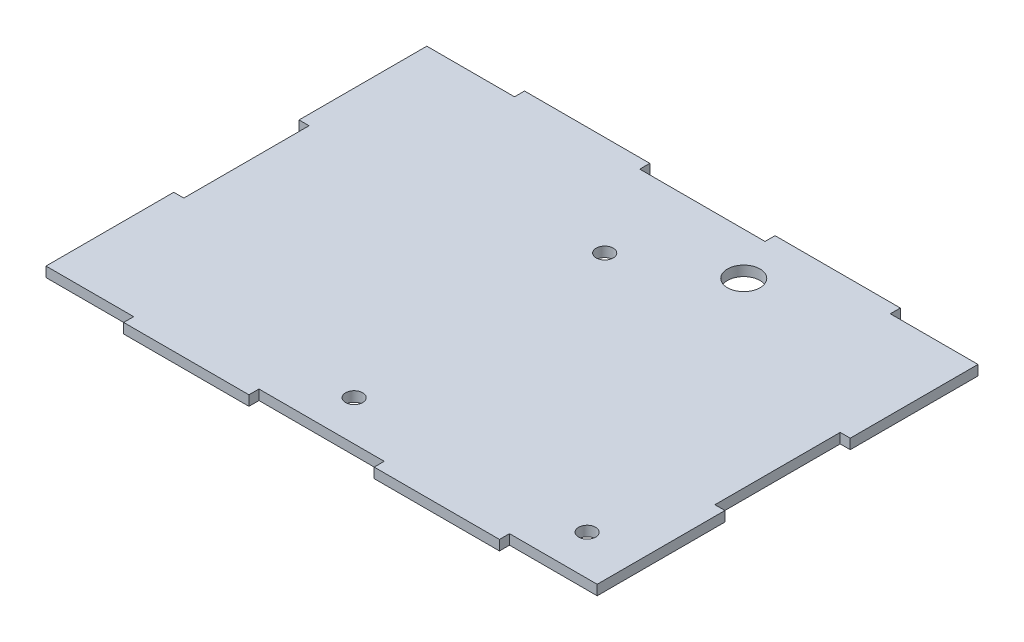
ISO-10303-21;
HEADER;
FILE_DESCRIPTION(('STEP AP214'),'2;1');
FILE_NAME('part.step','',(''),(''),'','','');
FILE_SCHEMA(('AUTOMOTIVE_DESIGN { 1 0 10303 214 1 1 1 1 }'));
ENDSEC;
DATA;
#1=APPLICATION_CONTEXT('core data for automotive mechanical design processes');
#2=APPLICATION_PROTOCOL_DEFINITION('international standard','automotive_design',2000,#1);
#3=PRODUCT_CONTEXT('',#1,'mechanical');
#4=PRODUCT('Part','Part','',(#3));
#5=PRODUCT_RELATED_PRODUCT_CATEGORY('part','',(#4));
#6=PRODUCT_DEFINITION_FORMATION('','',#4);
#7=PRODUCT_DEFINITION_CONTEXT('part definition',#1,'design');
#8=PRODUCT_DEFINITION('design','',#6,#7);
#9=PRODUCT_DEFINITION_SHAPE('','',#8);
#10=(LENGTH_UNIT() NAMED_UNIT(*) SI_UNIT(.MILLI.,.METRE.));
#11=(NAMED_UNIT(*) PLANE_ANGLE_UNIT() SI_UNIT($,.RADIAN.));
#12=(NAMED_UNIT(*) SI_UNIT($,.STERADIAN.) SOLID_ANGLE_UNIT());
#13=UNCERTAINTY_MEASURE_WITH_UNIT(LENGTH_MEASURE(1.E-05),#10,'distance_accuracy_value','');
#14=(GEOMETRIC_REPRESENTATION_CONTEXT(3) GLOBAL_UNCERTAINTY_ASSIGNED_CONTEXT((#13)) GLOBAL_UNIT_ASSIGNED_CONTEXT((#10,
#11,#12)) REPRESENTATION_CONTEXT('',''));
#15=CARTESIAN_POINT('',(0.,0.,0.));
#16=DIRECTION('',(0.,0.,1.));
#17=DIRECTION('',(1.,0.,0.));
#18=AXIS2_PLACEMENT_3D('',#15,#16,#17);
#19=CARTESIAN_POINT('',(-106.,4.,-25.));
#20=DIRECTION('',(0.,0.,-1.));
#21=DIRECTION('',(-1.,0.,0.));
#22=AXIS2_PLACEMENT_3D('',#19,#20,#21);
#23=PLANE('',#22);
#24=DIRECTION('',(1.,0.,0.));
#25=VECTOR('',#24,1.);
#26=CARTESIAN_POINT('',(-106.,0.,-25.));
#27=LINE('',#26,#25);
#28=CARTESIAN_POINT('',(-110.,0.,-25.));
#29=VERTEX_POINT('',#28);
#30=CARTESIAN_POINT('',(-106.,0.,-25.));
#31=VERTEX_POINT('',#30);
#32=EDGE_CURVE('E265',#29,#31,#27,.T.);
#33=ORIENTED_EDGE('',*,*,#32,.T.);
#34=DIRECTION('',(0.,-1.,0.));
#35=VECTOR('',#34,1.);
#36=CARTESIAN_POINT('',(-106.,4.,-25.));
#37=LINE('',#36,#35);
#38=CARTESIAN_POINT('',(-106.,4.,-25.));
#39=VERTEX_POINT('',#38);
#40=EDGE_CURVE('E11',#39,#31,#37,.T.);
#41=ORIENTED_EDGE('',*,*,#40,.F.);
#42=DIRECTION('',(1.,0.,0.));
#43=VECTOR('',#42,1.);
#44=CARTESIAN_POINT('',(-106.,4.,-25.));
#45=LINE('',#44,#43);
#46=CARTESIAN_POINT('',(-110.,4.,-25.));
#47=VERTEX_POINT('',#46);
#48=EDGE_CURVE('E348',#47,#39,#45,.T.);
#49=ORIENTED_EDGE('',*,*,#48,.F.);
#50=DIRECTION('',(0.,-1.,0.));
#51=VECTOR('',#50,1.);
#52=CARTESIAN_POINT('',(-110.,4.,-25.));
#53=LINE('',#52,#51);
#54=EDGE_CURVE('E261',#47,#29,#53,.T.);
#55=ORIENTED_EDGE('',*,*,#54,.T.);
#56=EDGE_LOOP('',(#33,#41,#49,#55));
#57=FACE_BOUND('',#56,.T.);
#58=ADVANCED_FACE('F44',(#57),#23,.F.);
#59=CARTESIAN_POINT('',(-106.,4.,-25.));
#60=DIRECTION('',(1.,0.,0.));
#61=DIRECTION('',(0.,0.,-1.));
#62=AXIS2_PLACEMENT_3D('',#59,#60,#61);
#63=PLANE('',#62);
#64=DIRECTION('',(0.,0.,1.));
#65=VECTOR('',#64,1.);
#66=CARTESIAN_POINT('',(-106.,0.,-25.));
#67=LINE('',#66,#65);
#68=CARTESIAN_POINT('',(-106.,0.,25.));
#69=VERTEX_POINT('',#68);
#70=EDGE_CURVE('E269',#31,#69,#67,.T.);
#71=ORIENTED_EDGE('',*,*,#70,.T.);
#72=DIRECTION('',(0.,-1.,0.));
#73=VECTOR('',#72,1.);
#74=CARTESIAN_POINT('',(-106.,4.,25.));
#75=LINE('',#74,#73);
#76=CARTESIAN_POINT('',(-106.,4.,25.));
#77=VERTEX_POINT('',#76);
#78=EDGE_CURVE('E53',#77,#69,#75,.T.);
#79=ORIENTED_EDGE('',*,*,#78,.F.);
#80=DIRECTION('',(0.,0.,1.));
#81=VECTOR('',#80,1.);
#82=CARTESIAN_POINT('',(-106.,4.,-25.));
#83=LINE('',#82,#81);
#84=EDGE_CURVE('E164',#39,#77,#83,.T.);
#85=ORIENTED_EDGE('',*,*,#84,.F.);
#86=ORIENTED_EDGE('',*,*,#40,.T.);
#87=EDGE_LOOP('',(#71,#79,#85,#86));
#88=FACE_BOUND('',#87,.T.);
#89=ADVANCED_FACE('F556',(#88),#63,.F.);
#90=CARTESIAN_POINT('',(-106.,4.,25.));
#91=DIRECTION('',(0.,0.,1.));
#92=DIRECTION('',(1.,0.,0.));
#93=AXIS2_PLACEMENT_3D('',#90,#91,#92);
#94=PLANE('',#93);
#95=DIRECTION('',(-1.,0.,0.));
#96=VECTOR('',#95,1.);
#97=CARTESIAN_POINT('',(-106.,0.,25.));
#98=LINE('',#97,#96);
#99=CARTESIAN_POINT('',(-110.,0.,25.));
#100=VERTEX_POINT('',#99);
#101=EDGE_CURVE('E273',#69,#100,#98,.T.);
#102=ORIENTED_EDGE('',*,*,#101,.T.);
#103=DIRECTION('',(0.,-1.,0.));
#104=VECTOR('',#103,1.);
#105=CARTESIAN_POINT('',(-110.,4.,25.));
#106=LINE('',#105,#104);
#107=CARTESIAN_POINT('',(-110.,4.,25.));
#108=VERTEX_POINT('',#107);
#109=EDGE_CURVE('E439',#108,#100,#106,.T.);
#110=ORIENTED_EDGE('',*,*,#109,.F.);
#111=DIRECTION('',(-1.,0.,0.));
#112=VECTOR('',#111,1.);
#113=CARTESIAN_POINT('',(-106.,4.,25.));
#114=LINE('',#113,#112);
#115=EDGE_CURVE('E449',#77,#108,#114,.T.);
#116=ORIENTED_EDGE('',*,*,#115,.F.);
#117=ORIENTED_EDGE('',*,*,#78,.T.);
#118=EDGE_LOOP('',(#102,#110,#116,#117));
#119=FACE_BOUND('',#118,.T.);
#120=ADVANCED_FACE('F447',(#119),#94,.F.);
#121=CARTESIAN_POINT('',(-110.,4.,25.));
#122=DIRECTION('',(1.,0.,0.));
#123=DIRECTION('',(0.,0.,-1.));
#124=AXIS2_PLACEMENT_3D('',#121,#122,#123);
#125=PLANE('',#124);
#126=DIRECTION('',(0.,0.,1.));
#127=VECTOR('',#126,1.);
#128=CARTESIAN_POINT('',(-110.,0.,25.));
#129=LINE('',#128,#127);
#130=CARTESIAN_POINT('',(-110.,0.,76.));
#131=VERTEX_POINT('',#130);
#132=EDGE_CURVE('E276',#100,#131,#129,.T.);
#133=ORIENTED_EDGE('',*,*,#132,.T.);
#134=DIRECTION('',(0.,-1.,0.));
#135=VECTOR('',#134,1.);
#136=CARTESIAN_POINT('',(-110.,4.,76.));
#137=LINE('',#136,#135);
#138=CARTESIAN_POINT('',(-110.,4.,76.));
#139=VERTEX_POINT('',#138);
#140=EDGE_CURVE('E435',#139,#131,#137,.T.);
#141=ORIENTED_EDGE('',*,*,#140,.F.);
#142=DIRECTION('',(0.,0.,1.));
#143=VECTOR('',#142,1.);
#144=CARTESIAN_POINT('',(-110.,4.,25.));
#145=LINE('',#144,#143);
#146=EDGE_CURVE('E468',#108,#139,#145,.T.);
#147=ORIENTED_EDGE('',*,*,#146,.F.);
#148=ORIENTED_EDGE('',*,*,#109,.T.);
#149=EDGE_LOOP('',(#133,#141,#147,#148));
#150=FACE_BOUND('',#149,.T.);
#151=ADVANCED_FACE('F458',(#150),#125,.F.);
#152=CARTESIAN_POINT('',(-110.,4.,76.));
#153=DIRECTION('',(0.,0.,-1.));
#154=DIRECTION('',(-1.,0.,0.));
#155=AXIS2_PLACEMENT_3D('',#152,#153,#154);
#156=PLANE('',#155);
#157=DIRECTION('',(1.,0.,0.));
#158=VECTOR('',#157,1.);
#159=CARTESIAN_POINT('',(-110.,0.,76.));
#160=LINE('',#159,#158);
#161=CARTESIAN_POINT('',(-75.,0.,76.));
#162=VERTEX_POINT('',#161);
#163=EDGE_CURVE('E279',#131,#162,#160,.T.);
#164=ORIENTED_EDGE('',*,*,#163,.T.);
#165=DIRECTION('',(0.,-1.,0.));
#166=VECTOR('',#165,1.);
#167=CARTESIAN_POINT('',(-75.,4.,76.));
#168=LINE('',#167,#166);
#169=CARTESIAN_POINT('',(-75.,4.,76.));
#170=VERTEX_POINT('',#169);
#171=EDGE_CURVE('E431',#170,#162,#168,.T.);
#172=ORIENTED_EDGE('',*,*,#171,.F.);
#173=DIRECTION('',(1.,0.,0.));
#174=VECTOR('',#173,1.);
#175=CARTESIAN_POINT('',(-110.,4.,76.));
#176=LINE('',#175,#174);
#177=EDGE_CURVE('E464',#139,#170,#176,.T.);
#178=ORIENTED_EDGE('',*,*,#177,.F.);
#179=ORIENTED_EDGE('',*,*,#140,.T.);
#180=EDGE_LOOP('',(#164,#172,#178,#179));
#181=FACE_BOUND('',#180,.T.);
#182=ADVANCED_FACE('F462',(#181),#156,.F.);
#183=CARTESIAN_POINT('',(-75.,4.,80.));
#184=DIRECTION('',(1.,0.,0.));
#185=DIRECTION('',(0.,0.,-1.));
#186=AXIS2_PLACEMENT_3D('',#183,#184,#185);
#187=PLANE('',#186);
#188=DIRECTION('',(0.,0.,1.));
#189=VECTOR('',#188,1.);
#190=CARTESIAN_POINT('',(-75.,0.,80.));
#191=LINE('',#190,#189);
#192=CARTESIAN_POINT('',(-75.,0.,80.));
#193=VERTEX_POINT('',#192);
#194=EDGE_CURVE('E282',#162,#193,#191,.T.);
#195=ORIENTED_EDGE('',*,*,#194,.T.);
#196=DIRECTION('',(0.,-1.,0.));
#197=VECTOR('',#196,1.);
#198=CARTESIAN_POINT('',(-75.,4.,80.));
#199=LINE('',#198,#197);
#200=CARTESIAN_POINT('',(-75.,4.,80.));
#201=VERTEX_POINT('',#200);
#202=EDGE_CURVE('E427',#201,#193,#199,.T.);
#203=ORIENTED_EDGE('',*,*,#202,.F.);
#204=DIRECTION('',(0.,0.,1.));
#205=VECTOR('',#204,1.);
#206=CARTESIAN_POINT('',(-75.,4.,80.));
#207=LINE('',#206,#205);
#208=EDGE_CURVE('E467',#170,#201,#207,.T.);
#209=ORIENTED_EDGE('',*,*,#208,.F.);
#210=ORIENTED_EDGE('',*,*,#171,.T.);
#211=EDGE_LOOP('',(#195,#203,#209,#210));
#212=FACE_BOUND('',#211,.T.);
#213=ADVANCED_FACE('F569',(#212),#187,.F.);
#214=CARTESIAN_POINT('',(-75.,4.,80.));
#215=DIRECTION('',(0.,0.,-1.));
#216=DIRECTION('',(-1.,0.,0.));
#217=AXIS2_PLACEMENT_3D('',#214,#215,#216);
#218=PLANE('',#217);
#219=DIRECTION('',(1.,0.,0.));
#220=VECTOR('',#219,1.);
#221=CARTESIAN_POINT('',(-75.,0.,80.));
#222=LINE('',#221,#220);
#223=CARTESIAN_POINT('',(-25.,0.,80.));
#224=VERTEX_POINT('',#223);
#225=EDGE_CURVE('E285',#193,#224,#222,.T.);
#226=ORIENTED_EDGE('',*,*,#225,.T.);
#227=DIRECTION('',(0.,-1.,0.));
#228=VECTOR('',#227,1.);
#229=CARTESIAN_POINT('',(-25.,4.,80.));
#230=LINE('',#229,#228);
#231=CARTESIAN_POINT('',(-25.,4.,80.));
#232=VERTEX_POINT('',#231);
#233=EDGE_CURVE('E423',#232,#224,#230,.T.);
#234=ORIENTED_EDGE('',*,*,#233,.F.);
#235=DIRECTION('',(1.,0.,0.));
#236=VECTOR('',#235,1.);
#237=CARTESIAN_POINT('',(-75.,4.,80.));
#238=LINE('',#237,#236);
#239=EDGE_CURVE('E472',#201,#232,#238,.T.);
#240=ORIENTED_EDGE('',*,*,#239,.F.);
#241=ORIENTED_EDGE('',*,*,#202,.T.);
#242=EDGE_LOOP('',(#226,#234,#240,#241));
#243=FACE_BOUND('',#242,.T.);
#244=ADVANCED_FACE('F572',(#243),#218,.F.);
#245=CARTESIAN_POINT('',(-25.,4.,76.));
#246=DIRECTION('',(-1.,0.,0.));
#247=DIRECTION('',(0.,0.,1.));
#248=AXIS2_PLACEMENT_3D('',#245,#246,#247);
#249=PLANE('',#248);
#250=DIRECTION('',(0.,0.,-1.));
#251=VECTOR('',#250,1.);
#252=CARTESIAN_POINT('',(-25.,0.,76.));
#253=LINE('',#252,#251);
#254=CARTESIAN_POINT('',(-25.,0.,76.));
#255=VERTEX_POINT('',#254);
#256=EDGE_CURVE('E288',#224,#255,#253,.T.);
#257=ORIENTED_EDGE('',*,*,#256,.T.);
#258=DIRECTION('',(0.,-1.,0.));
#259=VECTOR('',#258,1.);
#260=CARTESIAN_POINT('',(-25.,4.,76.));
#261=LINE('',#260,#259);
#262=CARTESIAN_POINT('',(-25.,4.,76.));
#263=VERTEX_POINT('',#262);
#264=EDGE_CURVE('E419',#263,#255,#261,.T.);
#265=ORIENTED_EDGE('',*,*,#264,.F.);
#266=DIRECTION('',(0.,0.,-1.));
#267=VECTOR('',#266,1.);
#268=CARTESIAN_POINT('',(-25.,4.,76.));
#269=LINE('',#268,#267);
#270=EDGE_CURVE('E479',#232,#263,#269,.T.);
#271=ORIENTED_EDGE('',*,*,#270,.F.);
#272=ORIENTED_EDGE('',*,*,#233,.T.);
#273=EDGE_LOOP('',(#257,#265,#271,#272));
#274=FACE_BOUND('',#273,.T.);
#275=ADVANCED_FACE('F576',(#274),#249,.F.);
#276=CARTESIAN_POINT('',(-25.,4.,76.));
#277=DIRECTION('',(0.,0.,-1.));
#278=DIRECTION('',(-1.,0.,0.));
#279=AXIS2_PLACEMENT_3D('',#276,#277,#278);
#280=PLANE('',#279);
#281=DIRECTION('',(1.,0.,0.));
#282=VECTOR('',#281,1.);
#283=CARTESIAN_POINT('',(-25.,0.,76.));
#284=LINE('',#283,#282);
#285=CARTESIAN_POINT('',(25.,0.,76.));
#286=VERTEX_POINT('',#285);
#287=EDGE_CURVE('E291',#255,#286,#284,.T.);
#288=ORIENTED_EDGE('',*,*,#287,.T.);
#289=DIRECTION('',(0.,-1.,0.));
#290=VECTOR('',#289,1.);
#291=CARTESIAN_POINT('',(25.,4.,76.));
#292=LINE('',#291,#290);
#293=CARTESIAN_POINT('',(25.,4.,76.));
#294=VERTEX_POINT('',#293);
#295=EDGE_CURVE('E415',#294,#286,#292,.T.);
#296=ORIENTED_EDGE('',*,*,#295,.F.);
#297=DIRECTION('',(1.,0.,0.));
#298=VECTOR('',#297,1.);
#299=CARTESIAN_POINT('',(-25.,4.,76.));
#300=LINE('',#299,#298);
#301=EDGE_CURVE('E482',#263,#294,#300,.T.);
#302=ORIENTED_EDGE('',*,*,#301,.F.);
#303=ORIENTED_EDGE('',*,*,#264,.T.);
#304=EDGE_LOOP('',(#288,#296,#302,#303));
#305=FACE_BOUND('',#304,.T.);
#306=ADVANCED_FACE('F580',(#305),#280,.F.);
#307=CARTESIAN_POINT('',(25.,4.,76.));
#308=DIRECTION('',(1.,0.,0.));
#309=DIRECTION('',(0.,0.,-1.));
#310=AXIS2_PLACEMENT_3D('',#307,#308,#309);
#311=PLANE('',#310);
#312=DIRECTION('',(0.,0.,1.));
#313=VECTOR('',#312,1.);
#314=CARTESIAN_POINT('',(25.,0.,76.));
#315=LINE('',#314,#313);
#316=CARTESIAN_POINT('',(25.,0.,80.));
#317=VERTEX_POINT('',#316);
#318=EDGE_CURVE('E294',#286,#317,#315,.T.);
#319=ORIENTED_EDGE('',*,*,#318,.T.);
#320=DIRECTION('',(0.,-1.,0.));
#321=VECTOR('',#320,1.);
#322=CARTESIAN_POINT('',(25.,4.,80.));
#323=LINE('',#322,#321);
#324=CARTESIAN_POINT('',(25.,4.,80.));
#325=VERTEX_POINT('',#324);
#326=EDGE_CURVE('E411',#325,#317,#323,.T.);
#327=ORIENTED_EDGE('',*,*,#326,.F.);
#328=DIRECTION('',(0.,0.,1.));
#329=VECTOR('',#328,1.);
#330=CARTESIAN_POINT('',(25.,4.,76.));
#331=LINE('',#330,#329);
#332=EDGE_CURVE('E485',#294,#325,#331,.T.);
#333=ORIENTED_EDGE('',*,*,#332,.F.);
#334=ORIENTED_EDGE('',*,*,#295,.T.);
#335=EDGE_LOOP('',(#319,#327,#333,#334));
#336=FACE_BOUND('',#335,.T.);
#337=ADVANCED_FACE('F584',(#336),#311,.F.);
#338=CARTESIAN_POINT('',(25.,4.,80.));
#339=DIRECTION('',(0.,0.,-1.));
#340=DIRECTION('',(-1.,0.,0.));
#341=AXIS2_PLACEMENT_3D('',#338,#339,#340);
#342=PLANE('',#341);
#343=DIRECTION('',(1.,0.,0.));
#344=VECTOR('',#343,1.);
#345=CARTESIAN_POINT('',(25.,0.,80.));
#346=LINE('',#345,#344);
#347=CARTESIAN_POINT('',(75.,0.,80.));
#348=VERTEX_POINT('',#347);
#349=EDGE_CURVE('E297',#317,#348,#346,.T.);
#350=ORIENTED_EDGE('',*,*,#349,.T.);
#351=DIRECTION('',(0.,-1.,0.));
#352=VECTOR('',#351,1.);
#353=CARTESIAN_POINT('',(75.,4.,80.));
#354=LINE('',#353,#352);
#355=CARTESIAN_POINT('',(75.,4.,80.));
#356=VERTEX_POINT('',#355);
#357=EDGE_CURVE('E407',#356,#348,#354,.T.);
#358=ORIENTED_EDGE('',*,*,#357,.F.);
#359=DIRECTION('',(1.,0.,0.));
#360=VECTOR('',#359,1.);
#361=CARTESIAN_POINT('',(25.,4.,80.));
#362=LINE('',#361,#360);
#363=EDGE_CURVE('E488',#325,#356,#362,.T.);
#364=ORIENTED_EDGE('',*,*,#363,.F.);
#365=ORIENTED_EDGE('',*,*,#326,.T.);
#366=EDGE_LOOP('',(#350,#358,#364,#365));
#367=FACE_BOUND('',#366,.T.);
#368=ADVANCED_FACE('F588',(#367),#342,.F.);
#369=CARTESIAN_POINT('',(75.,4.,80.));
#370=DIRECTION('',(-1.,0.,0.));
#371=DIRECTION('',(0.,0.,1.));
#372=AXIS2_PLACEMENT_3D('',#369,#370,#371);
#373=PLANE('',#372);
#374=DIRECTION('',(0.,0.,-1.));
#375=VECTOR('',#374,1.);
#376=CARTESIAN_POINT('',(75.,0.,80.));
#377=LINE('',#376,#375);
#378=CARTESIAN_POINT('',(75.,0.,76.));
#379=VERTEX_POINT('',#378);
#380=EDGE_CURVE('E300',#348,#379,#377,.T.);
#381=ORIENTED_EDGE('',*,*,#380,.T.);
#382=DIRECTION('',(0.,-1.,0.));
#383=VECTOR('',#382,1.);
#384=CARTESIAN_POINT('',(75.,4.,76.));
#385=LINE('',#384,#383);
#386=CARTESIAN_POINT('',(75.,4.,76.));
#387=VERTEX_POINT('',#386);
#388=EDGE_CURVE('E403',#387,#379,#385,.T.);
#389=ORIENTED_EDGE('',*,*,#388,.F.);
#390=DIRECTION('',(0.,0.,-1.));
#391=VECTOR('',#390,1.);
#392=CARTESIAN_POINT('',(75.,4.,80.));
#393=LINE('',#392,#391);
#394=EDGE_CURVE('E491',#356,#387,#393,.T.);
#395=ORIENTED_EDGE('',*,*,#394,.F.);
#396=ORIENTED_EDGE('',*,*,#357,.T.);
#397=EDGE_LOOP('',(#381,#389,#395,#396));
#398=FACE_BOUND('',#397,.T.);
#399=ADVANCED_FACE('F592',(#398),#373,.F.);
#400=CARTESIAN_POINT('',(75.,4.,76.));
#401=DIRECTION('',(0.,0.,-1.));
#402=DIRECTION('',(-1.,0.,0.));
#403=AXIS2_PLACEMENT_3D('',#400,#401,#402);
#404=PLANE('',#403);
#405=DIRECTION('',(1.,0.,0.));
#406=VECTOR('',#405,1.);
#407=CARTESIAN_POINT('',(75.,0.,76.));
#408=LINE('',#407,#406);
#409=CARTESIAN_POINT('',(110.,0.,76.));
#410=VERTEX_POINT('',#409);
#411=EDGE_CURVE('E303',#379,#410,#408,.T.);
#412=ORIENTED_EDGE('',*,*,#411,.T.);
#413=DIRECTION('',(0.,-1.,0.));
#414=VECTOR('',#413,1.);
#415=CARTESIAN_POINT('',(110.,4.,76.));
#416=LINE('',#415,#414);
#417=CARTESIAN_POINT('',(110.,4.,76.));
#418=VERTEX_POINT('',#417);
#419=EDGE_CURVE('E399',#418,#410,#416,.T.);
#420=ORIENTED_EDGE('',*,*,#419,.F.);
#421=DIRECTION('',(1.,0.,0.));
#422=VECTOR('',#421,1.);
#423=CARTESIAN_POINT('',(75.,4.,76.));
#424=LINE('',#423,#422);
#425=EDGE_CURVE('E494',#387,#418,#424,.T.);
#426=ORIENTED_EDGE('',*,*,#425,.F.);
#427=ORIENTED_EDGE('',*,*,#388,.T.);
#428=EDGE_LOOP('',(#412,#420,#426,#427));
#429=FACE_BOUND('',#428,.T.);
#430=ADVANCED_FACE('F596',(#429),#404,.F.);
#431=CARTESIAN_POINT('',(110.,4.,76.));
#432=DIRECTION('',(-1.,0.,0.));
#433=DIRECTION('',(0.,0.,1.));
#434=AXIS2_PLACEMENT_3D('',#431,#432,#433);
#435=PLANE('',#434);
#436=DIRECTION('',(0.,0.,-1.));
#437=VECTOR('',#436,1.);
#438=CARTESIAN_POINT('',(110.,0.,76.));
#439=LINE('',#438,#437);
#440=CARTESIAN_POINT('',(110.,0.,25.));
#441=VERTEX_POINT('',#440);
#442=EDGE_CURVE('E306',#410,#441,#439,.T.);
#443=ORIENTED_EDGE('',*,*,#442,.T.);
#444=DIRECTION('',(0.,-1.,0.));
#445=VECTOR('',#444,1.);
#446=CARTESIAN_POINT('',(110.,4.,25.));
#447=LINE('',#446,#445);
#448=CARTESIAN_POINT('',(110.,4.,25.));
#449=VERTEX_POINT('',#448);
#450=EDGE_CURVE('E395',#449,#441,#447,.T.);
#451=ORIENTED_EDGE('',*,*,#450,.F.);
#452=DIRECTION('',(0.,0.,-1.));
#453=VECTOR('',#452,1.);
#454=CARTESIAN_POINT('',(110.,4.,76.));
#455=LINE('',#454,#453);
#456=EDGE_CURVE('E497',#418,#449,#455,.T.);
#457=ORIENTED_EDGE('',*,*,#456,.F.);
#458=ORIENTED_EDGE('',*,*,#419,.T.);
#459=EDGE_LOOP('',(#443,#451,#457,#458));
#460=FACE_BOUND('',#459,.T.);
#461=ADVANCED_FACE('F600',(#460),#435,.F.);
#462=CARTESIAN_POINT('',(106.,4.,25.));
#463=DIRECTION('',(0.,0.,1.));
#464=DIRECTION('',(1.,0.,0.));
#465=AXIS2_PLACEMENT_3D('',#462,#463,#464);
#466=PLANE('',#465);
#467=DIRECTION('',(-1.,0.,0.));
#468=VECTOR('',#467,1.);
#469=CARTESIAN_POINT('',(106.,0.,25.));
#470=LINE('',#469,#468);
#471=CARTESIAN_POINT('',(106.,0.,25.));
#472=VERTEX_POINT('',#471);
#473=EDGE_CURVE('E309',#441,#472,#470,.T.);
#474=ORIENTED_EDGE('',*,*,#473,.T.);
#475=DIRECTION('',(0.,-1.,0.));
#476=VECTOR('',#475,1.);
#477=CARTESIAN_POINT('',(106.,4.,25.));
#478=LINE('',#477,#476);
#479=CARTESIAN_POINT('',(106.,4.,25.));
#480=VERTEX_POINT('',#479);
#481=EDGE_CURVE('E391',#480,#472,#478,.T.);
#482=ORIENTED_EDGE('',*,*,#481,.F.);
#483=DIRECTION('',(-1.,0.,0.));
#484=VECTOR('',#483,1.);
#485=CARTESIAN_POINT('',(106.,4.,25.));
#486=LINE('',#485,#484);
#487=EDGE_CURVE('E500',#449,#480,#486,.T.);
#488=ORIENTED_EDGE('',*,*,#487,.F.);
#489=ORIENTED_EDGE('',*,*,#450,.T.);
#490=EDGE_LOOP('',(#474,#482,#488,#489));
#491=FACE_BOUND('',#490,.T.);
#492=ADVANCED_FACE('F604',(#491),#466,.F.);
#493=CARTESIAN_POINT('',(106.,4.,-25.));
#494=DIRECTION('',(-1.,0.,0.));
#495=DIRECTION('',(0.,0.,1.));
#496=AXIS2_PLACEMENT_3D('',#493,#494,#495);
#497=PLANE('',#496);
#498=DIRECTION('',(0.,0.,-1.));
#499=VECTOR('',#498,1.);
#500=CARTESIAN_POINT('',(106.,0.,-25.));
#501=LINE('',#500,#499);
#502=CARTESIAN_POINT('',(106.,0.,-25.));
#503=VERTEX_POINT('',#502);
#504=EDGE_CURVE('E312',#472,#503,#501,.T.);
#505=ORIENTED_EDGE('',*,*,#504,.T.);
#506=DIRECTION('',(0.,-1.,0.));
#507=VECTOR('',#506,1.);
#508=CARTESIAN_POINT('',(106.,4.,-25.));
#509=LINE('',#508,#507);
#510=CARTESIAN_POINT('',(106.,4.,-25.));
#511=VERTEX_POINT('',#510);
#512=EDGE_CURVE('E387',#511,#503,#509,.T.);
#513=ORIENTED_EDGE('',*,*,#512,.F.);
#514=DIRECTION('',(0.,0.,-1.));
#515=VECTOR('',#514,1.);
#516=CARTESIAN_POINT('',(106.,4.,-25.));
#517=LINE('',#516,#515);
#518=EDGE_CURVE('E503',#480,#511,#517,.T.);
#519=ORIENTED_EDGE('',*,*,#518,.F.);
#520=ORIENTED_EDGE('',*,*,#481,.T.);
#521=EDGE_LOOP('',(#505,#513,#519,#520));
#522=FACE_BOUND('',#521,.T.);
#523=ADVANCED_FACE('F608',(#522),#497,.F.);
#524=CARTESIAN_POINT('',(106.,4.,-25.));
#525=DIRECTION('',(0.,0.,-1.));
#526=DIRECTION('',(-1.,0.,0.));
#527=AXIS2_PLACEMENT_3D('',#524,#525,#526);
#528=PLANE('',#527);
#529=DIRECTION('',(1.,0.,0.));
#530=VECTOR('',#529,1.);
#531=CARTESIAN_POINT('',(106.,0.,-25.));
#532=LINE('',#531,#530);
#533=CARTESIAN_POINT('',(110.,0.,-25.));
#534=VERTEX_POINT('',#533);
#535=EDGE_CURVE('E315',#503,#534,#532,.T.);
#536=ORIENTED_EDGE('',*,*,#535,.T.);
#537=DIRECTION('',(0.,-1.,0.));
#538=VECTOR('',#537,1.);
#539=CARTESIAN_POINT('',(110.,4.,-25.));
#540=LINE('',#539,#538);
#541=CARTESIAN_POINT('',(110.,4.,-25.));
#542=VERTEX_POINT('',#541);
#543=EDGE_CURVE('E383',#542,#534,#540,.T.);
#544=ORIENTED_EDGE('',*,*,#543,.F.);
#545=DIRECTION('',(1.,0.,0.));
#546=VECTOR('',#545,1.);
#547=CARTESIAN_POINT('',(106.,4.,-25.));
#548=LINE('',#547,#546);
#549=EDGE_CURVE('E506',#511,#542,#548,.T.);
#550=ORIENTED_EDGE('',*,*,#549,.F.);
#551=ORIENTED_EDGE('',*,*,#512,.T.);
#552=EDGE_LOOP('',(#536,#544,#550,#551));
#553=FACE_BOUND('',#552,.T.);
#554=ADVANCED_FACE('F612',(#553),#528,.F.);
#555=CARTESIAN_POINT('',(110.,4.,-25.));
#556=DIRECTION('',(-1.,0.,0.));
#557=DIRECTION('',(0.,0.,1.));
#558=AXIS2_PLACEMENT_3D('',#555,#556,#557);
#559=PLANE('',#558);
#560=DIRECTION('',(0.,0.,-1.));
#561=VECTOR('',#560,1.);
#562=CARTESIAN_POINT('',(110.,0.,-25.));
#563=LINE('',#562,#561);
#564=CARTESIAN_POINT('',(110.,0.,-76.));
#565=VERTEX_POINT('',#564);
#566=EDGE_CURVE('E318',#534,#565,#563,.T.);
#567=ORIENTED_EDGE('',*,*,#566,.T.);
#568=DIRECTION('',(0.,-1.,0.));
#569=VECTOR('',#568,1.);
#570=CARTESIAN_POINT('',(110.,4.,-76.));
#571=LINE('',#570,#569);
#572=CARTESIAN_POINT('',(110.,4.,-76.));
#573=VERTEX_POINT('',#572);
#574=EDGE_CURVE('E379',#573,#565,#571,.T.);
#575=ORIENTED_EDGE('',*,*,#574,.F.);
#576=DIRECTION('',(0.,0.,-1.));
#577=VECTOR('',#576,1.);
#578=CARTESIAN_POINT('',(110.,4.,-25.));
#579=LINE('',#578,#577);
#580=EDGE_CURVE('E509',#542,#573,#579,.T.);
#581=ORIENTED_EDGE('',*,*,#580,.F.);
#582=ORIENTED_EDGE('',*,*,#543,.T.);
#583=EDGE_LOOP('',(#567,#575,#581,#582));
#584=FACE_BOUND('',#583,.T.);
#585=ADVANCED_FACE('F616',(#584),#559,.F.);
#586=CARTESIAN_POINT('',(75.,4.,-76.));
#587=DIRECTION('',(0.,0.,1.));
#588=DIRECTION('',(1.,0.,0.));
#589=AXIS2_PLACEMENT_3D('',#586,#587,#588);
#590=PLANE('',#589);
#591=DIRECTION('',(-1.,0.,0.));
#592=VECTOR('',#591,1.);
#593=CARTESIAN_POINT('',(75.,0.,-76.));
#594=LINE('',#593,#592);
#595=CARTESIAN_POINT('',(75.,0.,-76.));
#596=VERTEX_POINT('',#595);
#597=EDGE_CURVE('E321',#565,#596,#594,.T.);
#598=ORIENTED_EDGE('',*,*,#597,.T.);
#599=DIRECTION('',(0.,-1.,0.));
#600=VECTOR('',#599,1.);
#601=CARTESIAN_POINT('',(75.,4.,-76.));
#602=LINE('',#601,#600);
#603=CARTESIAN_POINT('',(75.,4.,-76.));
#604=VERTEX_POINT('',#603);
#605=EDGE_CURVE('E375',#604,#596,#602,.T.);
#606=ORIENTED_EDGE('',*,*,#605,.F.);
#607=DIRECTION('',(-1.,0.,0.));
#608=VECTOR('',#607,1.);
#609=CARTESIAN_POINT('',(75.,4.,-76.));
#610=LINE('',#609,#608);
#611=EDGE_CURVE('E512',#573,#604,#610,.T.);
#612=ORIENTED_EDGE('',*,*,#611,.F.);
#613=ORIENTED_EDGE('',*,*,#574,.T.);
#614=EDGE_LOOP('',(#598,#606,#612,#613));
#615=FACE_BOUND('',#614,.T.);
#616=ADVANCED_FACE('F620',(#615),#590,.F.);
#617=CARTESIAN_POINT('',(75.,4.,-80.));
#618=DIRECTION('',(-1.,0.,0.));
#619=DIRECTION('',(0.,0.,1.));
#620=AXIS2_PLACEMENT_3D('',#617,#618,#619);
#621=PLANE('',#620);
#622=DIRECTION('',(0.,0.,-1.));
#623=VECTOR('',#622,1.);
#624=CARTESIAN_POINT('',(75.,0.,-80.));
#625=LINE('',#624,#623);
#626=CARTESIAN_POINT('',(75.,0.,-80.));
#627=VERTEX_POINT('',#626);
#628=EDGE_CURVE('E324',#596,#627,#625,.T.);
#629=ORIENTED_EDGE('',*,*,#628,.T.);
#630=DIRECTION('',(0.,-1.,0.));
#631=VECTOR('',#630,1.);
#632=CARTESIAN_POINT('',(75.,4.,-80.));
#633=LINE('',#632,#631);
#634=CARTESIAN_POINT('',(75.,4.,-80.));
#635=VERTEX_POINT('',#634);
#636=EDGE_CURVE('E371',#635,#627,#633,.T.);
#637=ORIENTED_EDGE('',*,*,#636,.F.);
#638=DIRECTION('',(0.,0.,-1.));
#639=VECTOR('',#638,1.);
#640=CARTESIAN_POINT('',(75.,4.,-80.));
#641=LINE('',#640,#639);
#642=EDGE_CURVE('E515',#604,#635,#641,.T.);
#643=ORIENTED_EDGE('',*,*,#642,.F.);
#644=ORIENTED_EDGE('',*,*,#605,.T.);
#645=EDGE_LOOP('',(#629,#637,#643,#644));
#646=FACE_BOUND('',#645,.T.);
#647=ADVANCED_FACE('F624',(#646),#621,.F.);
#648=CARTESIAN_POINT('',(75.,4.,-80.));
#649=DIRECTION('',(0.,0.,1.));
#650=DIRECTION('',(1.,0.,0.));
#651=AXIS2_PLACEMENT_3D('',#648,#649,#650);
#652=PLANE('',#651);
#653=DIRECTION('',(-1.,0.,0.));
#654=VECTOR('',#653,1.);
#655=CARTESIAN_POINT('',(75.,0.,-80.));
#656=LINE('',#655,#654);
#657=CARTESIAN_POINT('',(25.,0.,-80.));
#658=VERTEX_POINT('',#657);
#659=EDGE_CURVE('E327',#627,#658,#656,.T.);
#660=ORIENTED_EDGE('',*,*,#659,.T.);
#661=DIRECTION('',(0.,-1.,0.));
#662=VECTOR('',#661,1.);
#663=CARTESIAN_POINT('',(25.,4.,-80.));
#664=LINE('',#663,#662);
#665=CARTESIAN_POINT('',(25.,4.,-80.));
#666=VERTEX_POINT('',#665);
#667=EDGE_CURVE('E367',#666,#658,#664,.T.);
#668=ORIENTED_EDGE('',*,*,#667,.F.);
#669=DIRECTION('',(-1.,0.,0.));
#670=VECTOR('',#669,1.);
#671=CARTESIAN_POINT('',(75.,4.,-80.));
#672=LINE('',#671,#670);
#673=EDGE_CURVE('E518',#635,#666,#672,.T.);
#674=ORIENTED_EDGE('',*,*,#673,.F.);
#675=ORIENTED_EDGE('',*,*,#636,.T.);
#676=EDGE_LOOP('',(#660,#668,#674,#675));
#677=FACE_BOUND('',#676,.T.);
#678=ADVANCED_FACE('F628',(#677),#652,.F.);
#679=CARTESIAN_POINT('',(25.,4.,-80.));
#680=DIRECTION('',(1.,0.,0.));
#681=DIRECTION('',(0.,0.,-1.));
#682=AXIS2_PLACEMENT_3D('',#679,#680,#681);
#683=PLANE('',#682);
#684=DIRECTION('',(0.,0.,1.));
#685=VECTOR('',#684,1.);
#686=CARTESIAN_POINT('',(25.,0.,-80.));
#687=LINE('',#686,#685);
#688=CARTESIAN_POINT('',(25.,0.,-76.));
#689=VERTEX_POINT('',#688);
#690=EDGE_CURVE('E330',#658,#689,#687,.T.);
#691=ORIENTED_EDGE('',*,*,#690,.T.);
#692=DIRECTION('',(0.,-1.,0.));
#693=VECTOR('',#692,1.);
#694=CARTESIAN_POINT('',(25.,4.,-76.));
#695=LINE('',#694,#693);
#696=CARTESIAN_POINT('',(25.,4.,-76.));
#697=VERTEX_POINT('',#696);
#698=EDGE_CURVE('E363',#697,#689,#695,.T.);
#699=ORIENTED_EDGE('',*,*,#698,.F.);
#700=DIRECTION('',(0.,0.,1.));
#701=VECTOR('',#700,1.);
#702=CARTESIAN_POINT('',(25.,4.,-80.));
#703=LINE('',#702,#701);
#704=EDGE_CURVE('E521',#666,#697,#703,.T.);
#705=ORIENTED_EDGE('',*,*,#704,.F.);
#706=ORIENTED_EDGE('',*,*,#667,.T.);
#707=EDGE_LOOP('',(#691,#699,#705,#706));
#708=FACE_BOUND('',#707,.T.);
#709=ADVANCED_FACE('F632',(#708),#683,.F.);
#710=CARTESIAN_POINT('',(-25.,4.,-76.));
#711=DIRECTION('',(0.,0.,1.));
#712=DIRECTION('',(1.,0.,0.));
#713=AXIS2_PLACEMENT_3D('',#710,#711,#712);
#714=PLANE('',#713);
#715=DIRECTION('',(-1.,0.,0.));
#716=VECTOR('',#715,1.);
#717=CARTESIAN_POINT('',(-25.,0.,-76.));
#718=LINE('',#717,#716);
#719=CARTESIAN_POINT('',(-25.,0.,-76.));
#720=VERTEX_POINT('',#719);
#721=EDGE_CURVE('E333',#689,#720,#718,.T.);
#722=ORIENTED_EDGE('',*,*,#721,.T.);
#723=DIRECTION('',(0.,-1.,0.));
#724=VECTOR('',#723,1.);
#725=CARTESIAN_POINT('',(-25.,4.,-76.));
#726=LINE('',#725,#724);
#727=CARTESIAN_POINT('',(-25.,4.,-76.));
#728=VERTEX_POINT('',#727);
#729=EDGE_CURVE('E359',#728,#720,#726,.T.);
#730=ORIENTED_EDGE('',*,*,#729,.F.);
#731=DIRECTION('',(-1.,0.,0.));
#732=VECTOR('',#731,1.);
#733=CARTESIAN_POINT('',(-25.,4.,-76.));
#734=LINE('',#733,#732);
#735=EDGE_CURVE('E524',#697,#728,#734,.T.);
#736=ORIENTED_EDGE('',*,*,#735,.F.);
#737=ORIENTED_EDGE('',*,*,#698,.T.);
#738=EDGE_LOOP('',(#722,#730,#736,#737));
#739=FACE_BOUND('',#738,.T.);
#740=ADVANCED_FACE('F636',(#739),#714,.F.);
#741=CARTESIAN_POINT('',(-25.,4.,-80.));
#742=DIRECTION('',(-1.,0.,0.));
#743=DIRECTION('',(0.,0.,1.));
#744=AXIS2_PLACEMENT_3D('',#741,#742,#743);
#745=PLANE('',#744);
#746=DIRECTION('',(0.,0.,-1.));
#747=VECTOR('',#746,1.);
#748=CARTESIAN_POINT('',(-25.,0.,-80.));
#749=LINE('',#748,#747);
#750=CARTESIAN_POINT('',(-25.,0.,-80.));
#751=VERTEX_POINT('',#750);
#752=EDGE_CURVE('E336',#720,#751,#749,.T.);
#753=ORIENTED_EDGE('',*,*,#752,.T.);
#754=DIRECTION('',(0.,-1.,0.));
#755=VECTOR('',#754,1.);
#756=CARTESIAN_POINT('',(-25.,4.,-80.));
#757=LINE('',#756,#755);
#758=CARTESIAN_POINT('',(-25.,4.,-80.));
#759=VERTEX_POINT('',#758);
#760=EDGE_CURVE('E355',#759,#751,#757,.T.);
#761=ORIENTED_EDGE('',*,*,#760,.F.);
#762=DIRECTION('',(0.,0.,-1.));
#763=VECTOR('',#762,1.);
#764=CARTESIAN_POINT('',(-25.,4.,-80.));
#765=LINE('',#764,#763);
#766=EDGE_CURVE('E527',#728,#759,#765,.T.);
#767=ORIENTED_EDGE('',*,*,#766,.F.);
#768=ORIENTED_EDGE('',*,*,#729,.T.);
#769=EDGE_LOOP('',(#753,#761,#767,#768));
#770=FACE_BOUND('',#769,.T.);
#771=ADVANCED_FACE('F535',(#770),#745,.F.);
#772=CARTESIAN_POINT('',(-25.,4.,-80.));
#773=DIRECTION('',(0.,0.,1.));
#774=DIRECTION('',(1.,0.,0.));
#775=AXIS2_PLACEMENT_3D('',#772,#773,#774);
#776=PLANE('',#775);
#777=DIRECTION('',(-1.,0.,0.));
#778=VECTOR('',#777,1.);
#779=CARTESIAN_POINT('',(-25.,0.,-80.));
#780=LINE('',#779,#778);
#781=CARTESIAN_POINT('',(-75.,0.,-80.));
#782=VERTEX_POINT('',#781);
#783=EDGE_CURVE('E339',#751,#782,#780,.T.);
#784=ORIENTED_EDGE('',*,*,#783,.T.);
#785=DIRECTION('',(0.,-1.,0.));
#786=VECTOR('',#785,1.);
#787=CARTESIAN_POINT('',(-75.,4.,-80.));
#788=LINE('',#787,#786);
#789=CARTESIAN_POINT('',(-75.,4.,-80.));
#790=VERTEX_POINT('',#789);
#791=EDGE_CURVE('E254',#790,#782,#788,.T.);
#792=ORIENTED_EDGE('',*,*,#791,.F.);
#793=DIRECTION('',(-1.,0.,0.));
#794=VECTOR('',#793,1.);
#795=CARTESIAN_POINT('',(-25.,4.,-80.));
#796=LINE('',#795,#794);
#797=EDGE_CURVE('E243',#759,#790,#796,.T.);
#798=ORIENTED_EDGE('',*,*,#797,.F.);
#799=ORIENTED_EDGE('',*,*,#760,.T.);
#800=EDGE_LOOP('',(#784,#792,#798,#799));
#801=FACE_BOUND('',#800,.T.);
#802=ADVANCED_FACE('F539',(#801),#776,.F.);
#803=CARTESIAN_POINT('',(-75.,4.,-76.));
#804=DIRECTION('',(1.,0.,0.));
#805=DIRECTION('',(0.,0.,-1.));
#806=AXIS2_PLACEMENT_3D('',#803,#804,#805);
#807=PLANE('',#806);
#808=DIRECTION('',(0.,0.,1.));
#809=VECTOR('',#808,1.);
#810=CARTESIAN_POINT('',(-75.,0.,-76.));
#811=LINE('',#810,#809);
#812=CARTESIAN_POINT('',(-75.,0.,-76.));
#813=VERTEX_POINT('',#812);
#814=EDGE_CURVE('E252',#782,#813,#811,.T.);
#815=ORIENTED_EDGE('',*,*,#814,.T.);
#816=DIRECTION('',(0.,-1.,0.));
#817=VECTOR('',#816,1.);
#818=CARTESIAN_POINT('',(-75.,4.,-76.));
#819=LINE('',#818,#817);
#820=CARTESIAN_POINT('',(-75.,4.,-76.));
#821=VERTEX_POINT('',#820);
#822=EDGE_CURVE('E249',#821,#813,#819,.T.);
#823=ORIENTED_EDGE('',*,*,#822,.F.);
#824=DIRECTION('',(0.,0.,1.));
#825=VECTOR('',#824,1.);
#826=CARTESIAN_POINT('',(-75.,4.,-76.));
#827=LINE('',#826,#825);
#828=EDGE_CURVE('E237',#790,#821,#827,.T.);
#829=ORIENTED_EDGE('',*,*,#828,.F.);
#830=ORIENTED_EDGE('',*,*,#791,.T.);
#831=EDGE_LOOP('',(#815,#823,#829,#830));
#832=FACE_BOUND('',#831,.T.);
#833=ADVANCED_FACE('F250',(#832),#807,.F.);
#834=CARTESIAN_POINT('',(-110.,4.,-76.));
#835=DIRECTION('',(0.,0.,1.));
#836=DIRECTION('',(1.,0.,0.));
#837=AXIS2_PLACEMENT_3D('',#834,#835,#836);
#838=PLANE('',#837);
#839=DIRECTION('',(-1.,0.,0.));
#840=VECTOR('',#839,1.);
#841=CARTESIAN_POINT('',(-110.,0.,-76.));
#842=LINE('',#841,#840);
#843=CARTESIAN_POINT('',(-110.,0.,-76.));
#844=VERTEX_POINT('',#843);
#845=EDGE_CURVE('E150',#813,#844,#842,.T.);
#846=ORIENTED_EDGE('',*,*,#845,.T.);
#847=DIRECTION('',(0.,-1.,0.));
#848=VECTOR('',#847,1.);
#849=CARTESIAN_POINT('',(-110.,4.,-76.));
#850=LINE('',#849,#848);
#851=CARTESIAN_POINT('',(-110.,4.,-76.));
#852=VERTEX_POINT('',#851);
#853=EDGE_CURVE('E255',#852,#844,#850,.T.);
#854=ORIENTED_EDGE('',*,*,#853,.F.);
#855=DIRECTION('',(-1.,0.,0.));
#856=VECTOR('',#855,1.);
#857=CARTESIAN_POINT('',(-110.,4.,-76.));
#858=LINE('',#857,#856);
#859=EDGE_CURVE('E241',#821,#852,#858,.T.);
#860=ORIENTED_EDGE('',*,*,#859,.F.);
#861=ORIENTED_EDGE('',*,*,#822,.T.);
#862=EDGE_LOOP('',(#846,#854,#860,#861));
#863=FACE_BOUND('',#862,.T.);
#864=ADVANCED_FACE('F257',(#863),#838,.F.);
#865=CARTESIAN_POINT('',(-110.,4.,-76.));
#866=DIRECTION('',(1.,0.,0.));
#867=DIRECTION('',(0.,0.,-1.));
#868=AXIS2_PLACEMENT_3D('',#865,#866,#867);
#869=PLANE('',#868);
#870=DIRECTION('',(0.,0.,1.));
#871=VECTOR('',#870,1.);
#872=CARTESIAN_POINT('',(-110.,0.,-76.));
#873=LINE('',#872,#871);
#874=EDGE_CURVE('E156',#844,#29,#873,.T.);
#875=ORIENTED_EDGE('',*,*,#874,.T.);
#876=ORIENTED_EDGE('',*,*,#54,.F.);
#877=DIRECTION('',(0.,0.,1.));
#878=VECTOR('',#877,1.);
#879=CARTESIAN_POINT('',(-110.,4.,-76.));
#880=LINE('',#879,#878);
#881=EDGE_CURVE('E61',#852,#47,#880,.T.);
#882=ORIENTED_EDGE('',*,*,#881,.F.);
#883=ORIENTED_EDGE('',*,*,#853,.T.);
#884=EDGE_LOOP('',(#875,#876,#882,#883));
#885=FACE_BOUND('',#884,.T.);
#886=ADVANCED_FACE('F543',(#885),#869,.F.);
#887=CARTESIAN_POINT('',(0.,4.,0.));
#888=DIRECTION('',(0.,1.,0.));
#889=DIRECTION('',(0.,0.,1.));
#890=AXIS2_PLACEMENT_3D('',#887,#888,#889);
#891=PLANE('',#890);
#892=CARTESIAN_POINT('',(33.5,4.,-59.));
#893=DIRECTION('',(0.,1.,0.));
#894=DIRECTION('',(0.,0.,1.));
#895=AXIS2_PLACEMENT_3D('',#892,#893,#894);
#896=CIRCLE('',#895,6.5);
#897=CARTESIAN_POINT('',(33.5,4.,-52.5));
#898=VERTEX_POINT('',#897);
#899=EDGE_CURVE('E722',#898,#898,#896,.T.);
#900=ORIENTED_EDGE('',*,*,#899,.F.);
#901=EDGE_LOOP('',(#900));
#902=FACE_BOUND('',#901,.T.);
#903=CARTESIAN_POINT('',(90.,4.,60.));
#904=DIRECTION('',(0.,1.,0.));
#905=DIRECTION('',(0.,0.,1.));
#906=AXIS2_PLACEMENT_3D('',#903,#904,#905);
#907=CIRCLE('',#906,3.41);
#908=CARTESIAN_POINT('',(90.,4.,63.41));
#909=VERTEX_POINT('',#908);
#910=EDGE_CURVE('E732',#909,#909,#907,.T.);
#911=ORIENTED_EDGE('',*,*,#910,.F.);
#912=EDGE_LOOP('',(#911));
#913=FACE_BOUND('',#912,.T.);
#914=CARTESIAN_POINT('',(-3.00000000000002,4.,60.));
#915=DIRECTION('',(0.,1.,0.));
#916=DIRECTION('',(0.,0.,1.));
#917=AXIS2_PLACEMENT_3D('',#914,#915,#916);
#918=CIRCLE('',#917,3.41);
#919=CARTESIAN_POINT('',(-3.00000000000002,4.,63.41));
#920=VERTEX_POINT('',#919);
#921=EDGE_CURVE('E736',#920,#920,#918,.T.);
#922=ORIENTED_EDGE('',*,*,#921,.F.);
#923=EDGE_LOOP('',(#922));
#924=FACE_BOUND('',#923,.T.);
#925=CARTESIAN_POINT('',(-3.00000000000002,4.,-40.));
#926=DIRECTION('',(0.,1.,0.));
#927=DIRECTION('',(0.,0.,1.));
#928=AXIS2_PLACEMENT_3D('',#925,#926,#927);
#929=CIRCLE('',#928,3.41);
#930=CARTESIAN_POINT('',(-3.00000000000002,4.,-36.59));
#931=VERTEX_POINT('',#930);
#932=EDGE_CURVE('E744',#931,#931,#929,.T.);
#933=ORIENTED_EDGE('',*,*,#932,.F.);
#934=EDGE_LOOP('',(#933));
#935=FACE_BOUND('',#934,.T.);
#936=ORIENTED_EDGE('',*,*,#48,.T.);
#937=ORIENTED_EDGE('',*,*,#84,.T.);
#938=ORIENTED_EDGE('',*,*,#115,.T.);
#939=ORIENTED_EDGE('',*,*,#146,.T.);
#940=ORIENTED_EDGE('',*,*,#177,.T.);
#941=ORIENTED_EDGE('',*,*,#208,.T.);
#942=ORIENTED_EDGE('',*,*,#239,.T.);
#943=ORIENTED_EDGE('',*,*,#270,.T.);
#944=ORIENTED_EDGE('',*,*,#301,.T.);
#945=ORIENTED_EDGE('',*,*,#332,.T.);
#946=ORIENTED_EDGE('',*,*,#363,.T.);
#947=ORIENTED_EDGE('',*,*,#394,.T.);
#948=ORIENTED_EDGE('',*,*,#425,.T.);
#949=ORIENTED_EDGE('',*,*,#456,.T.);
#950=ORIENTED_EDGE('',*,*,#487,.T.);
#951=ORIENTED_EDGE('',*,*,#518,.T.);
#952=ORIENTED_EDGE('',*,*,#549,.T.);
#953=ORIENTED_EDGE('',*,*,#580,.T.);
#954=ORIENTED_EDGE('',*,*,#611,.T.);
#955=ORIENTED_EDGE('',*,*,#642,.T.);
#956=ORIENTED_EDGE('',*,*,#673,.T.);
#957=ORIENTED_EDGE('',*,*,#704,.T.);
#958=ORIENTED_EDGE('',*,*,#735,.T.);
#959=ORIENTED_EDGE('',*,*,#766,.T.);
#960=ORIENTED_EDGE('',*,*,#797,.T.);
#961=ORIENTED_EDGE('',*,*,#828,.T.);
#962=ORIENTED_EDGE('',*,*,#859,.T.);
#963=ORIENTED_EDGE('',*,*,#881,.T.);
#964=EDGE_LOOP('',(#936,#937,#938,#939,#940,#941,#942,#943,#944,#945,#946,#947,#948,#949,#950,
#951,#952,#953,#954,#955,#956,#957,#958,#959,#960,#961,#962,#963));
#965=FACE_BOUND('',#964,.T.);
#966=ADVANCED_FACE('F239',(#902,#913,#924,#935,#965),#891,.T.);
#967=CARTESIAN_POINT('',(0.,0.,0.));
#968=DIRECTION('',(0.,1.,0.));
#969=DIRECTION('',(0.,0.,1.));
#970=AXIS2_PLACEMENT_3D('',#967,#968,#969);
#971=PLANE('',#970);
#972=CARTESIAN_POINT('',(33.5,0.,-59.));
#973=DIRECTION('',(0.,1.,0.));
#974=DIRECTION('',(0.,0.,1.));
#975=AXIS2_PLACEMENT_3D('',#972,#973,#974);
#976=CIRCLE('',#975,6.5);
#977=CARTESIAN_POINT('',(33.5,0.,-52.5));
#978=VERTEX_POINT('',#977);
#979=EDGE_CURVE('E719',#978,#978,#976,.T.);
#980=ORIENTED_EDGE('',*,*,#979,.T.);
#981=EDGE_LOOP('',(#980));
#982=FACE_BOUND('',#981,.T.);
#983=CARTESIAN_POINT('',(90.,0.,60.));
#984=DIRECTION('',(0.,1.,0.));
#985=DIRECTION('',(0.,0.,1.));
#986=AXIS2_PLACEMENT_3D('',#983,#984,#985);
#987=CIRCLE('',#986,3.41);
#988=CARTESIAN_POINT('',(90.,0.,63.41));
#989=VERTEX_POINT('',#988);
#990=EDGE_CURVE('E270',#989,#989,#987,.T.);
#991=ORIENTED_EDGE('',*,*,#990,.T.);
#992=EDGE_LOOP('',(#991));
#993=FACE_BOUND('',#992,.T.);
#994=CARTESIAN_POINT('',(-3.00000000000002,0.,60.));
#995=DIRECTION('',(0.,1.,0.));
#996=DIRECTION('',(0.,0.,1.));
#997=AXIS2_PLACEMENT_3D('',#994,#995,#996);
#998=CIRCLE('',#997,3.41);
#999=CARTESIAN_POINT('',(-3.00000000000002,0.,63.41));
#1000=VERTEX_POINT('',#999);
#1001=EDGE_CURVE('E740',#1000,#1000,#998,.T.);
#1002=ORIENTED_EDGE('',*,*,#1001,.T.);
#1003=EDGE_LOOP('',(#1002));
#1004=FACE_BOUND('',#1003,.T.);
#1005=CARTESIAN_POINT('',(-3.00000000000002,0.,-40.));
#1006=DIRECTION('',(0.,1.,0.));
#1007=DIRECTION('',(0.,0.,1.));
#1008=AXIS2_PLACEMENT_3D('',#1005,#1006,#1007);
#1009=CIRCLE('',#1008,3.41);
#1010=CARTESIAN_POINT('',(-3.00000000000002,0.,-36.59));
#1011=VERTEX_POINT('',#1010);
#1012=EDGE_CURVE('E726',#1011,#1011,#1009,.T.);
#1013=ORIENTED_EDGE('',*,*,#1012,.T.);
#1014=EDGE_LOOP('',(#1013));
#1015=FACE_BOUND('',#1014,.T.);
#1016=ORIENTED_EDGE('',*,*,#32,.F.);
#1017=ORIENTED_EDGE('',*,*,#874,.F.);
#1018=ORIENTED_EDGE('',*,*,#845,.F.);
#1019=ORIENTED_EDGE('',*,*,#814,.F.);
#1020=ORIENTED_EDGE('',*,*,#783,.F.);
#1021=ORIENTED_EDGE('',*,*,#752,.F.);
#1022=ORIENTED_EDGE('',*,*,#721,.F.);
#1023=ORIENTED_EDGE('',*,*,#690,.F.);
#1024=ORIENTED_EDGE('',*,*,#659,.F.);
#1025=ORIENTED_EDGE('',*,*,#628,.F.);
#1026=ORIENTED_EDGE('',*,*,#597,.F.);
#1027=ORIENTED_EDGE('',*,*,#566,.F.);
#1028=ORIENTED_EDGE('',*,*,#535,.F.);
#1029=ORIENTED_EDGE('',*,*,#504,.F.);
#1030=ORIENTED_EDGE('',*,*,#473,.F.);
#1031=ORIENTED_EDGE('',*,*,#442,.F.);
#1032=ORIENTED_EDGE('',*,*,#411,.F.);
#1033=ORIENTED_EDGE('',*,*,#380,.F.);
#1034=ORIENTED_EDGE('',*,*,#349,.F.);
#1035=ORIENTED_EDGE('',*,*,#318,.F.);
#1036=ORIENTED_EDGE('',*,*,#287,.F.);
#1037=ORIENTED_EDGE('',*,*,#256,.F.);
#1038=ORIENTED_EDGE('',*,*,#225,.F.);
#1039=ORIENTED_EDGE('',*,*,#194,.F.);
#1040=ORIENTED_EDGE('',*,*,#163,.F.);
#1041=ORIENTED_EDGE('',*,*,#132,.F.);
#1042=ORIENTED_EDGE('',*,*,#101,.F.);
#1043=ORIENTED_EDGE('',*,*,#70,.F.);
#1044=EDGE_LOOP('',(#1016,#1017,#1018,#1019,#1020,#1021,#1022,#1023,#1024,#1025,#1026,#1027,
#1028,#1029,#1030,#1031,#1032,#1033,#1034,#1035,#1036,#1037,#1038,#1039,#1040,#1041,#1042,#1043));
#1045=FACE_BOUND('',#1044,.T.);
#1046=ADVANCED_FACE('F453',(#982,#993,#1004,#1015,#1045),#971,.F.);
#1047=CARTESIAN_POINT('',(-3.00000000000002,0.,-40.));
#1048=DIRECTION('',(0.,1.,0.));
#1049=DIRECTION('',(0.,0.,1.));
#1050=AXIS2_PLACEMENT_3D('',#1047,#1048,#1049);
#1051=CYLINDRICAL_SURFACE('',#1050,3.41);
#1052=ORIENTED_EDGE('',*,*,#1012,.F.);
#1053=EDGE_LOOP('',(#1052));
#1054=FACE_BOUND('',#1053,.T.);
#1055=ORIENTED_EDGE('',*,*,#932,.T.);
#1056=EDGE_LOOP('',(#1055));
#1057=FACE_BOUND('',#1056,.T.);
#1058=ADVANCED_FACE('F676',(#1054,#1057),#1051,.F.);
#1059=CARTESIAN_POINT('',(-3.00000000000002,0.,60.));
#1060=DIRECTION('',(0.,1.,0.));
#1061=DIRECTION('',(0.,0.,1.));
#1062=AXIS2_PLACEMENT_3D('',#1059,#1060,#1061);
#1063=CYLINDRICAL_SURFACE('',#1062,3.41);
#1064=ORIENTED_EDGE('',*,*,#1001,.F.);
#1065=EDGE_LOOP('',(#1064));
#1066=FACE_BOUND('',#1065,.T.);
#1067=ORIENTED_EDGE('',*,*,#921,.T.);
#1068=EDGE_LOOP('',(#1067));
#1069=FACE_BOUND('',#1068,.T.);
#1070=ADVANCED_FACE('F685',(#1066,#1069),#1063,.F.);
#1071=CARTESIAN_POINT('',(90.,0.,60.));
#1072=DIRECTION('',(0.,1.,0.));
#1073=DIRECTION('',(0.,0.,1.));
#1074=AXIS2_PLACEMENT_3D('',#1071,#1072,#1073);
#1075=CYLINDRICAL_SURFACE('',#1074,3.41);
#1076=ORIENTED_EDGE('',*,*,#990,.F.);
#1077=EDGE_LOOP('',(#1076));
#1078=FACE_BOUND('',#1077,.T.);
#1079=ORIENTED_EDGE('',*,*,#910,.T.);
#1080=EDGE_LOOP('',(#1079));
#1081=FACE_BOUND('',#1080,.T.);
#1082=ADVANCED_FACE('F695',(#1078,#1081),#1075,.F.);
#1083=CARTESIAN_POINT('',(33.5,0.,-59.));
#1084=DIRECTION('',(0.,1.,0.));
#1085=DIRECTION('',(0.,0.,1.));
#1086=AXIS2_PLACEMENT_3D('',#1083,#1084,#1085);
#1087=CYLINDRICAL_SURFACE('',#1086,6.5);
#1088=ORIENTED_EDGE('',*,*,#979,.F.);
#1089=EDGE_LOOP('',(#1088));
#1090=FACE_BOUND('',#1089,.T.);
#1091=ORIENTED_EDGE('',*,*,#899,.T.);
#1092=EDGE_LOOP('',(#1091));
#1093=FACE_BOUND('',#1092,.T.);
#1094=ADVANCED_FACE('F704',(#1090,#1093),#1087,.F.);
#1095=CLOSED_SHELL('',(#58,#89,#120,#151,#182,#213,#244,#275,#306,#337,#368,#399,#430,#461,#492,
#523,#554,#585,#616,#647,#678,#709,#740,#771,#802,#833,#864,#886,#966,#1046,#1058,#1070,#1082,#1094));
#1096=MANIFOLD_SOLID_BREP('B2',#1095);
#1097=ADVANCED_BREP_SHAPE_REPRESENTATION('',(#18,#1096),#14);
#1098=SHAPE_DEFINITION_REPRESENTATION(#9,#1097);
ENDSEC;
END-ISO-10303-21;
